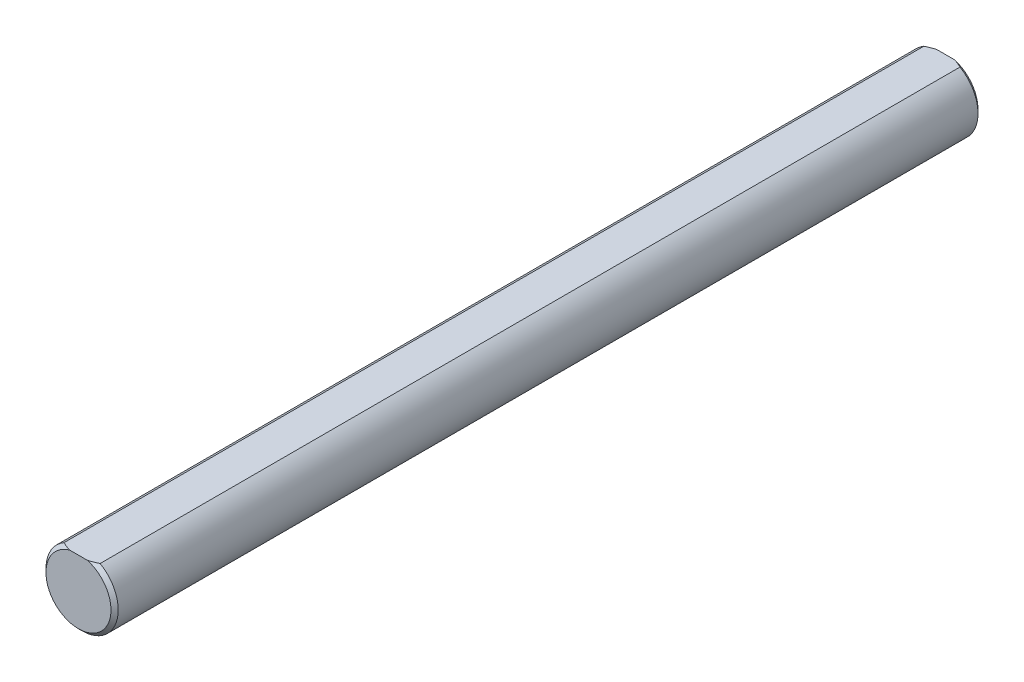
ISO-10303-21;
HEADER;
FILE_DESCRIPTION(('STEP AP214'),'2;1');
FILE_NAME('part.step','',(''),(''),'','','');
FILE_SCHEMA(('AUTOMOTIVE_DESIGN { 1 0 10303 214 1 1 1 1 }'));
ENDSEC;
DATA;
#1=APPLICATION_CONTEXT('core data for automotive mechanical design processes');
#2=APPLICATION_PROTOCOL_DEFINITION('international standard','automotive_design',2000,#1);
#3=PRODUCT_CONTEXT('',#1,'mechanical');
#4=PRODUCT('Part','Part','',(#3));
#5=PRODUCT_RELATED_PRODUCT_CATEGORY('part','',(#4));
#6=PRODUCT_DEFINITION_FORMATION('','',#4);
#7=PRODUCT_DEFINITION_CONTEXT('part definition',#1,'design');
#8=PRODUCT_DEFINITION('design','',#6,#7);
#9=PRODUCT_DEFINITION_SHAPE('','',#8);
#10=(LENGTH_UNIT() NAMED_UNIT(*) SI_UNIT(.MILLI.,.METRE.));
#11=(NAMED_UNIT(*) PLANE_ANGLE_UNIT() SI_UNIT($,.RADIAN.));
#12=(NAMED_UNIT(*) SI_UNIT($,.STERADIAN.) SOLID_ANGLE_UNIT());
#13=UNCERTAINTY_MEASURE_WITH_UNIT(LENGTH_MEASURE(1.E-05),#10,'distance_accuracy_value','');
#14=(GEOMETRIC_REPRESENTATION_CONTEXT(3) GLOBAL_UNCERTAINTY_ASSIGNED_CONTEXT((#13)) GLOBAL_UNIT_ASSIGNED_CONTEXT((#10,
#11,#12)) REPRESENTATION_CONTEXT('',''));
#15=CARTESIAN_POINT('',(0.,0.,0.));
#16=DIRECTION('',(0.,0.,1.));
#17=DIRECTION('',(1.,0.,0.));
#18=AXIS2_PLACEMENT_3D('',#15,#16,#17);
#19=CARTESIAN_POINT('',(0.,0.,76.2));
#20=DIRECTION('',(0.,0.,-1.));
#21=DIRECTION('',(-1.,0.,0.));
#22=AXIS2_PLACEMENT_3D('',#19,#20,#21);
#23=CYLINDRICAL_SURFACE('',#22,6.35);
#24=DIRECTION('',(0.,0.,1.));
#25=VECTOR('',#24,1.);
#26=CARTESIAN_POINT('',(-3.175,5.49926131403118,-76.2));
#27=LINE('',#26,#25);
#28=CARTESIAN_POINT('',(-3.175,5.49926131403118,-75.5649999999999));
#29=VERTEX_POINT('',#28);
#30=CARTESIAN_POINT('',(-3.175,5.49926131403118,75.565));
#31=VERTEX_POINT('',#30);
#32=EDGE_CURVE('E79',#29,#31,#27,.T.);
#33=ORIENTED_EDGE('',*,*,#32,.F.);
#34=CARTESIAN_POINT('',(0.,0.,-75.5649999999999));
#35=DIRECTION('',(0.,0.,1.));
#36=DIRECTION('',(1.,0.,0.));
#37=AXIS2_PLACEMENT_3D('',#34,#35,#36);
#38=CIRCLE('',#37,6.35);
#39=CARTESIAN_POINT('',(3.175,5.49926131403118,-75.5649999999999));
#40=VERTEX_POINT('',#39);
#41=EDGE_CURVE('E90',#29,#40,#38,.T.);
#42=ORIENTED_EDGE('',*,*,#41,.T.);
#43=DIRECTION('',(0.,0.,1.));
#44=VECTOR('',#43,1.);
#45=CARTESIAN_POINT('',(3.175,5.49926131403118,-76.2));
#46=LINE('',#45,#44);
#47=CARTESIAN_POINT('',(3.175,5.49926131403118,75.565));
#48=VERTEX_POINT('',#47);
#49=EDGE_CURVE('E92',#40,#48,#46,.T.);
#50=ORIENTED_EDGE('',*,*,#49,.T.);
#51=CARTESIAN_POINT('',(0.,0.,75.5650000000001));
#52=DIRECTION('',(0.,0.,1.));
#53=DIRECTION('',(1.,0.,0.));
#54=AXIS2_PLACEMENT_3D('',#51,#52,#53);
#55=CIRCLE('',#54,6.35);
#56=EDGE_CURVE('E91',#48,#31,#55,.F.);
#57=ORIENTED_EDGE('',*,*,#56,.T.);
#58=EDGE_LOOP('',(#33,#42,#50,#57));
#59=FACE_BOUND('',#58,.T.);
#60=ADVANCED_FACE('F32',(#59),#23,.T.);
#61=CARTESIAN_POINT('',(0.,0.,76.2));
#62=DIRECTION('',(0.,0.,1.));
#63=DIRECTION('',(1.,0.,0.));
#64=AXIS2_PLACEMENT_3D('',#61,#62,#63);
#65=PLANE('',#64);
#66=DIRECTION('',(1.,0.,0.));
#67=VECTOR('',#66,1.);
#68=CARTESIAN_POINT('',(-3.175,5.49926131403118,76.2));
#69=LINE('',#68,#67);
#70=CARTESIAN_POINT('',(-1.55542598666767,5.49926131403118,76.2));
#71=VERTEX_POINT('',#70);
#72=CARTESIAN_POINT('',(1.55542598666767,5.49926131403118,76.2));
#73=VERTEX_POINT('',#72);
#74=EDGE_CURVE('E133',#71,#73,#69,.T.);
#75=ORIENTED_EDGE('',*,*,#74,.F.);
#76=CARTESIAN_POINT('',(0.,0.,76.2));
#77=DIRECTION('',(0.,0.,1.));
#78=DIRECTION('',(1.,0.,0.));
#79=AXIS2_PLACEMENT_3D('',#76,#77,#78);
#80=CIRCLE('',#79,5.71500000000009);
#81=EDGE_CURVE('E11',#71,#73,#80,.T.);
#82=ORIENTED_EDGE('',*,*,#81,.T.);
#83=EDGE_LOOP('',(#75,#82));
#84=FACE_BOUND('',#83,.T.);
#85=ADVANCED_FACE('F126',(#84),#65,.T.);
#86=CARTESIAN_POINT('',(0.,0.,-76.2));
#87=DIRECTION('',(0.,0.,1.));
#88=DIRECTION('',(1.,0.,0.));
#89=AXIS2_PLACEMENT_3D('',#86,#87,#88);
#90=PLANE('',#89);
#91=DIRECTION('',(1.,0.,0.));
#92=VECTOR('',#91,1.);
#93=CARTESIAN_POINT('',(-3.175,5.49926131403118,-76.2));
#94=LINE('',#93,#92);
#95=CARTESIAN_POINT('',(-1.55542598666685,5.49926131403118,-76.2));
#96=VERTEX_POINT('',#95);
#97=CARTESIAN_POINT('',(1.55542598666685,5.49926131403118,-76.2));
#98=VERTEX_POINT('',#97);
#99=EDGE_CURVE('E81',#96,#98,#94,.T.);
#100=ORIENTED_EDGE('',*,*,#99,.T.);
#101=CARTESIAN_POINT('',(0.,0.,-76.2));
#102=DIRECTION('',(0.,0.,1.));
#103=DIRECTION('',(1.,0.,0.));
#104=AXIS2_PLACEMENT_3D('',#101,#102,#103);
#105=CIRCLE('',#104,5.71499999999987);
#106=EDGE_CURVE('E41',#98,#96,#105,.F.);
#107=ORIENTED_EDGE('',*,*,#106,.T.);
#108=EDGE_LOOP('',(#100,#107));
#109=FACE_BOUND('',#108,.T.);
#110=ADVANCED_FACE('F109',(#109),#90,.F.);
#111=CARTESIAN_POINT('',(-3.175,5.49926131403118,-76.2));
#112=DIRECTION('',(0.,-1.,0.));
#113=DIRECTION('',(0.,0.,-1.));
#114=AXIS2_PLACEMENT_3D('',#111,#112,#113);
#115=PLANE('',#114);
#116=ORIENTED_EDGE('',*,*,#49,.F.);
#117=CARTESIAN_POINT('',(3.175,5.49926131403118,-75.5649999999999));
#118=CARTESIAN_POINT('',(3.04501033398536,5.49926131403118,-75.6299761649596));
#119=CARTESIAN_POINT('',(2.91380376476052,5.49926131403118,-75.6926038152387));
#120=CARTESIAN_POINT('',(2.6491645415403,5.49926131403118,-75.8120517028503));
#121=CARTESIAN_POINT('',(2.51573807775448,5.49926131403118,-75.8688856940337));
#122=CARTESIAN_POINT('',(2.2461783600497,5.49926131403118,-75.9759840114088));
#123=CARTESIAN_POINT('',(2.11004398072325,5.49926131403118,-76.0262455374683));
#124=CARTESIAN_POINT('',(1.8348445135756,5.49926131403118,-76.1191643918951));
#125=CARTESIAN_POINT('',(1.69577308655063,5.49926131403118,-76.1618028710614));
#126=CARTESIAN_POINT('',(1.55542598666685,5.49926131403118,-76.2));
#127=B_SPLINE_CURVE_WITH_KNOTS('',3,(#117,#118,#119,#120,#121,#122,#123,#124,#125,#126),
.UNSPECIFIED.,.F.,.F.,(4,2,2,2,4),(0.,0.436005137555672,0.870949859794538,1.30607928626144,
1.7422701913616),.UNSPECIFIED.);
#128=EDGE_CURVE('E85',#40,#98,#127,.T.);
#129=ORIENTED_EDGE('',*,*,#128,.T.);
#130=ORIENTED_EDGE('',*,*,#99,.F.);
#131=CARTESIAN_POINT('',(-1.55542598666685,5.49926131403118,-76.2));
#132=CARTESIAN_POINT('',(-1.69577308655062,5.49926131403118,-76.1618028710614));
#133=CARTESIAN_POINT('',(-1.83484451357559,5.49926131403118,-76.1191643918951));
#134=CARTESIAN_POINT('',(-2.11004398072325,5.49926131403118,-76.0262455374683));
#135=CARTESIAN_POINT('',(-2.2461783600497,5.49926131403118,-75.9759840114088));
#136=CARTESIAN_POINT('',(-2.51573807775448,5.49926131403118,-75.8688856940337));
#137=CARTESIAN_POINT('',(-2.6491645415403,5.49926131403118,-75.8120517028503));
#138=CARTESIAN_POINT('',(-2.91380376476052,5.49926131403118,-75.6926038152387));
#139=CARTESIAN_POINT('',(-3.04501033398536,5.49926131403118,-75.6299761649596));
#140=CARTESIAN_POINT('',(-3.175,5.49926131403118,-75.5649999999999));
#141=B_SPLINE_CURVE_WITH_KNOTS('',3,(#131,#132,#133,#134,#135,#136,#137,#138,#139,#140),
.UNSPECIFIED.,.F.,.F.,(4,2,2,2,4),(0.,0.43619090510017,0.871320331567069,1.30626505380594,
1.74227019136161),.UNSPECIFIED.);
#142=EDGE_CURVE('E75',#96,#29,#141,.T.);
#143=ORIENTED_EDGE('',*,*,#142,.T.);
#144=ORIENTED_EDGE('',*,*,#32,.T.);
#145=CARTESIAN_POINT('',(-3.175,5.49926131403118,75.5650000000001));
#146=CARTESIAN_POINT('',(-3.04501033398542,5.49926131403118,75.6299761649598));
#147=CARTESIAN_POINT('',(-2.91380376476064,5.49926131403118,75.6926038152388));
#148=CARTESIAN_POINT('',(-2.64916454154055,5.49926131403118,75.8120517028504));
#149=CARTESIAN_POINT('',(-2.5157380777548,5.49926131403118,75.8688856940338));
#150=CARTESIAN_POINT('',(-2.24617836005016,5.49926131403118,75.9759840114088));
#151=CARTESIAN_POINT('',(-2.11004398072378,5.49926131403118,76.0262455374683));
#152=CARTESIAN_POINT('',(-1.83484451357627,5.49926131403118,76.1191643918951));
#153=CARTESIAN_POINT('',(-1.69577308655137,5.49926131403118,76.1618028710614));
#154=CARTESIAN_POINT('',(-1.55542598666767,5.49926131403118,76.2));
#155=B_SPLINE_CURVE_WITH_KNOTS('',3,(#145,#146,#147,#148,#149,#150,#151,#152,#153,#154),
.UNSPECIFIED.,.F.,.F.,(4,2,2,2,4),(0.,0.436005137555465,0.870949859794119,1.30607928626081,
1.74227019136076),.UNSPECIFIED.);
#156=EDGE_CURVE('E55',#31,#71,#155,.T.);
#157=ORIENTED_EDGE('',*,*,#156,.T.);
#158=ORIENTED_EDGE('',*,*,#74,.T.);
#159=CARTESIAN_POINT('',(1.55542598666767,5.49926131403118,76.2));
#160=CARTESIAN_POINT('',(1.69577308655137,5.49926131403118,76.1618028710614));
#161=CARTESIAN_POINT('',(1.83484451357627,5.49926131403118,76.1191643918951));
#162=CARTESIAN_POINT('',(2.11004398072378,5.49926131403118,76.0262455374683));
#163=CARTESIAN_POINT('',(2.24617836005016,5.49926131403118,75.9759840114088));
#164=CARTESIAN_POINT('',(2.5157380777548,5.49926131403118,75.8688856940338));
#165=CARTESIAN_POINT('',(2.64916454154055,5.49926131403118,75.8120517028504));
#166=CARTESIAN_POINT('',(2.91380376476064,5.49926131403118,75.6926038152388));
#167=CARTESIAN_POINT('',(3.04501033398542,5.49926131403118,75.6299761649598));
#168=CARTESIAN_POINT('',(3.175,5.49926131403118,75.5650000000001));
#169=B_SPLINE_CURVE_WITH_KNOTS('',3,(#159,#160,#161,#162,#163,#164,#165,#166,#167,#168),
.UNSPECIFIED.,.F.,.F.,(4,2,2,2,4),(0.,0.436190905099954,0.871320331566643,1.3062650538053,
1.74227019136076),.UNSPECIFIED.);
#170=EDGE_CURVE('E48',#73,#48,#169,.T.);
#171=ORIENTED_EDGE('',*,*,#170,.T.);
#172=EDGE_LOOP('',(#116,#129,#130,#143,#144,#157,#158,#171));
#173=FACE_BOUND('',#172,.T.);
#174=ADVANCED_FACE('F78',(#173),#115,.F.);
#175=CARTESIAN_POINT('',(0.,0.,-75.5649999999999));
#176=DIRECTION('',(0.,0.,1.));
#177=DIRECTION('',(1.,0.,0.));
#178=AXIS2_PLACEMENT_3D('',#175,#176,#177);
#179=CONICAL_SURFACE('',#178,6.35,0.785398163397442);
#180=ORIENTED_EDGE('',*,*,#142,.F.);
#181=ORIENTED_EDGE('',*,*,#106,.F.);
#182=ORIENTED_EDGE('',*,*,#128,.F.);
#183=ORIENTED_EDGE('',*,*,#41,.F.);
#184=EDGE_LOOP('',(#180,#181,#182,#183));
#185=FACE_BOUND('',#184,.T.);
#186=ADVANCED_FACE('F94',(#185),#179,.T.);
#187=CARTESIAN_POINT('',(0.,0.,76.2));
#188=DIRECTION('',(0.,0.,-1.));
#189=DIRECTION('',(-1.,0.,0.));
#190=AXIS2_PLACEMENT_3D('',#187,#188,#189);
#191=CONICAL_SURFACE('',#190,5.71500000000009,0.785398163397442);
#192=ORIENTED_EDGE('',*,*,#156,.F.);
#193=ORIENTED_EDGE('',*,*,#56,.F.);
#194=ORIENTED_EDGE('',*,*,#170,.F.);
#195=ORIENTED_EDGE('',*,*,#81,.F.);
#196=EDGE_LOOP('',(#192,#193,#194,#195));
#197=FACE_BOUND('',#196,.T.);
#198=ADVANCED_FACE('F34',(#197),#191,.T.);
#199=CLOSED_SHELL('',(#60,#85,#110,#174,#186,#198));
#200=MANIFOLD_SOLID_BREP('B2',#199);
#201=ADVANCED_BREP_SHAPE_REPRESENTATION('',(#18,#200),#14);
#202=SHAPE_DEFINITION_REPRESENTATION(#9,#201);
ENDSEC;
END-ISO-10303-21;
